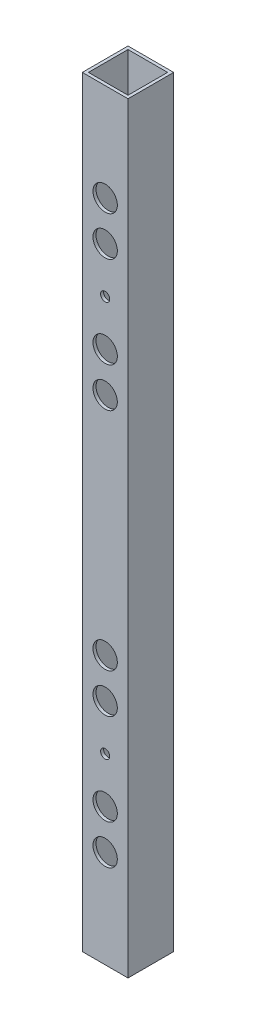
ISO-10303-21;
HEADER;
FILE_DESCRIPTION(('STEP AP214'),'2;1');
FILE_NAME('part.step','',(''),(''),'','','');
FILE_SCHEMA(('AUTOMOTIVE_DESIGN { 1 0 10303 214 1 1 1 1 }'));
ENDSEC;
DATA;
#1=APPLICATION_CONTEXT('core data for automotive mechanical design processes');
#2=APPLICATION_PROTOCOL_DEFINITION('international standard','automotive_design',2000,#1);
#3=PRODUCT_CONTEXT('',#1,'mechanical');
#4=PRODUCT('Part','Part','',(#3));
#5=PRODUCT_RELATED_PRODUCT_CATEGORY('part','',(#4));
#6=PRODUCT_DEFINITION_FORMATION('','',#4);
#7=PRODUCT_DEFINITION_CONTEXT('part definition',#1,'design');
#8=PRODUCT_DEFINITION('design','',#6,#7);
#9=PRODUCT_DEFINITION_SHAPE('','',#8);
#10=(LENGTH_UNIT() NAMED_UNIT(*) SI_UNIT(.MILLI.,.METRE.));
#11=(NAMED_UNIT(*) PLANE_ANGLE_UNIT() SI_UNIT($,.RADIAN.));
#12=(NAMED_UNIT(*) SI_UNIT($,.STERADIAN.) SOLID_ANGLE_UNIT());
#13=UNCERTAINTY_MEASURE_WITH_UNIT(LENGTH_MEASURE(1.E-05),#10,'distance_accuracy_value','');
#14=(GEOMETRIC_REPRESENTATION_CONTEXT(3) GLOBAL_UNCERTAINTY_ASSIGNED_CONTEXT((#13)) GLOBAL_UNIT_ASSIGNED_CONTEXT((#10,
#11,#12)) REPRESENTATION_CONTEXT('',''));
#15=CARTESIAN_POINT('',(0.,0.,0.));
#16=DIRECTION('',(0.,0.,1.));
#17=DIRECTION('',(1.,0.,0.));
#18=AXIS2_PLACEMENT_3D('',#15,#16,#17);
#19=CARTESIAN_POINT('',(0.,250.,0.));
#20=DIRECTION('',(0.,-1.,0.));
#21=DIRECTION('',(0.,0.,-1.));
#22=AXIS2_PLACEMENT_3D('',#19,#20,#21);
#23=PLANE('',#22);
#24=DIRECTION('',(0.,0.,-1.));
#25=VECTOR('',#24,1.);
#26=CARTESIAN_POINT('',(7.5,250.,7.5));
#27=LINE('',#26,#25);
#28=CARTESIAN_POINT('',(7.5,250.,7.5));
#29=VERTEX_POINT('',#28);
#30=CARTESIAN_POINT('',(7.5,250.,-7.5));
#31=VERTEX_POINT('',#30);
#32=EDGE_CURVE('E139',#29,#31,#27,.T.);
#33=ORIENTED_EDGE('',*,*,#32,.T.);
#34=DIRECTION('',(-1.,0.,0.));
#35=VECTOR('',#34,1.);
#36=CARTESIAN_POINT('',(-7.5,250.,-7.5));
#37=LINE('',#36,#35);
#38=CARTESIAN_POINT('',(-7.5,250.,-7.5));
#39=VERTEX_POINT('',#38);
#40=EDGE_CURVE('E142',#31,#39,#37,.T.);
#41=ORIENTED_EDGE('',*,*,#40,.T.);
#42=DIRECTION('',(0.,0.,1.));
#43=VECTOR('',#42,1.);
#44=CARTESIAN_POINT('',(-7.5,250.,7.5));
#45=LINE('',#44,#43);
#46=CARTESIAN_POINT('',(-7.5,250.,7.5));
#47=VERTEX_POINT('',#46);
#48=EDGE_CURVE('E145',#39,#47,#45,.T.);
#49=ORIENTED_EDGE('',*,*,#48,.T.);
#50=DIRECTION('',(1.,0.,0.));
#51=VECTOR('',#50,1.);
#52=CARTESIAN_POINT('',(-7.5,250.,7.5));
#53=LINE('',#52,#51);
#54=EDGE_CURVE('E147',#47,#29,#53,.T.);
#55=ORIENTED_EDGE('',*,*,#54,.T.);
#56=EDGE_LOOP('',(#33,#41,#49,#55));
#57=FACE_BOUND('',#56,.T.);
#58=DIRECTION('',(0.,0.,1.));
#59=VECTOR('',#58,1.);
#60=CARTESIAN_POINT('',(-6.5,250.,6.5));
#61=LINE('',#60,#59);
#62=CARTESIAN_POINT('',(-6.5,250.,-6.5));
#63=VERTEX_POINT('',#62);
#64=CARTESIAN_POINT('',(-6.5,250.,6.5));
#65=VERTEX_POINT('',#64);
#66=EDGE_CURVE('E101',#63,#65,#61,.T.);
#67=ORIENTED_EDGE('',*,*,#66,.F.);
#68=DIRECTION('',(-1.,0.,0.));
#69=VECTOR('',#68,1.);
#70=CARTESIAN_POINT('',(-6.5,250.,-6.5));
#71=LINE('',#70,#69);
#72=CARTESIAN_POINT('',(6.5,250.,-6.5));
#73=VERTEX_POINT('',#72);
#74=EDGE_CURVE('E123',#73,#63,#71,.T.);
#75=ORIENTED_EDGE('',*,*,#74,.F.);
#76=DIRECTION('',(0.,0.,-1.));
#77=VECTOR('',#76,1.);
#78=CARTESIAN_POINT('',(6.5,250.,6.5));
#79=LINE('',#78,#77);
#80=CARTESIAN_POINT('',(6.5,250.,6.5));
#81=VERTEX_POINT('',#80);
#82=EDGE_CURVE('E121',#81,#73,#79,.T.);
#83=ORIENTED_EDGE('',*,*,#82,.F.);
#84=DIRECTION('',(1.,0.,0.));
#85=VECTOR('',#84,1.);
#86=CARTESIAN_POINT('',(-6.5,250.,6.5));
#87=LINE('',#86,#85);
#88=EDGE_CURVE('E109',#65,#81,#87,.T.);
#89=ORIENTED_EDGE('',*,*,#88,.F.);
#90=EDGE_LOOP('',(#67,#75,#83,#89));
#91=FACE_BOUND('',#90,.T.);
#92=ADVANCED_FACE('F34',(#57,#91),#23,.F.);
#93=CARTESIAN_POINT('',(0.,0.,0.));
#94=DIRECTION('',(0.,-1.,0.));
#95=DIRECTION('',(0.,0.,-1.));
#96=AXIS2_PLACEMENT_3D('',#93,#94,#95);
#97=PLANE('',#96);
#98=DIRECTION('',(0.,0.,-1.));
#99=VECTOR('',#98,1.);
#100=CARTESIAN_POINT('',(7.5,0.,7.5));
#101=LINE('',#100,#99);
#102=CARTESIAN_POINT('',(7.5,0.,7.5));
#103=VERTEX_POINT('',#102);
#104=CARTESIAN_POINT('',(7.5,0.,-7.5));
#105=VERTEX_POINT('',#104);
#106=EDGE_CURVE('E117',#103,#105,#101,.T.);
#107=ORIENTED_EDGE('',*,*,#106,.F.);
#108=DIRECTION('',(1.,0.,0.));
#109=VECTOR('',#108,1.);
#110=CARTESIAN_POINT('',(-7.5,0.,7.5));
#111=LINE('',#110,#109);
#112=CARTESIAN_POINT('',(-7.5,0.,7.5));
#113=VERTEX_POINT('',#112);
#114=EDGE_CURVE('E143',#113,#103,#111,.T.);
#115=ORIENTED_EDGE('',*,*,#114,.F.);
#116=DIRECTION('',(0.,0.,1.));
#117=VECTOR('',#116,1.);
#118=CARTESIAN_POINT('',(-7.5,0.,7.5));
#119=LINE('',#118,#117);
#120=CARTESIAN_POINT('',(-7.5,0.,-7.5));
#121=VERTEX_POINT('',#120);
#122=EDGE_CURVE('E154',#121,#113,#119,.T.);
#123=ORIENTED_EDGE('',*,*,#122,.F.);
#124=DIRECTION('',(-1.,0.,0.));
#125=VECTOR('',#124,1.);
#126=CARTESIAN_POINT('',(-7.5,0.,-7.5));
#127=LINE('',#126,#125);
#128=EDGE_CURVE('E152',#105,#121,#127,.T.);
#129=ORIENTED_EDGE('',*,*,#128,.F.);
#130=EDGE_LOOP('',(#107,#115,#123,#129));
#131=FACE_BOUND('',#130,.T.);
#132=DIRECTION('',(-1.,0.,0.));
#133=VECTOR('',#132,1.);
#134=CARTESIAN_POINT('',(-6.5,0.,-6.5));
#135=LINE('',#134,#133);
#136=CARTESIAN_POINT('',(6.5,0.,-6.5));
#137=VERTEX_POINT('',#136);
#138=CARTESIAN_POINT('',(-6.5,0.,-6.5));
#139=VERTEX_POINT('',#138);
#140=EDGE_CURVE('E110',#137,#139,#135,.T.);
#141=ORIENTED_EDGE('',*,*,#140,.T.);
#142=DIRECTION('',(0.,0.,1.));
#143=VECTOR('',#142,1.);
#144=CARTESIAN_POINT('',(-6.5,0.,6.5));
#145=LINE('',#144,#143);
#146=CARTESIAN_POINT('',(-6.5,0.,6.5));
#147=VERTEX_POINT('',#146);
#148=EDGE_CURVE('E59',#139,#147,#145,.T.);
#149=ORIENTED_EDGE('',*,*,#148,.T.);
#150=DIRECTION('',(1.,0.,0.));
#151=VECTOR('',#150,1.);
#152=CARTESIAN_POINT('',(-6.5,0.,6.5));
#153=LINE('',#152,#151);
#154=CARTESIAN_POINT('',(6.5,0.,6.5));
#155=VERTEX_POINT('',#154);
#156=EDGE_CURVE('E116',#147,#155,#153,.T.);
#157=ORIENTED_EDGE('',*,*,#156,.T.);
#158=DIRECTION('',(0.,0.,-1.));
#159=VECTOR('',#158,1.);
#160=CARTESIAN_POINT('',(6.5,0.,6.5));
#161=LINE('',#160,#159);
#162=EDGE_CURVE('E131',#155,#137,#161,.T.);
#163=ORIENTED_EDGE('',*,*,#162,.T.);
#164=EDGE_LOOP('',(#141,#149,#157,#163));
#165=FACE_BOUND('',#164,.T.);
#166=ADVANCED_FACE('F290',(#131,#165),#97,.T.);
#167=CARTESIAN_POINT('',(7.5,250.,7.5));
#168=DIRECTION('',(-1.,0.,0.));
#169=DIRECTION('',(0.,0.,1.));
#170=AXIS2_PLACEMENT_3D('',#167,#168,#169);
#171=PLANE('',#170);
#172=ORIENTED_EDGE('',*,*,#106,.T.);
#173=DIRECTION('',(0.,-1.,0.));
#174=VECTOR('',#173,1.);
#175=CARTESIAN_POINT('',(7.5,250.,-7.5));
#176=LINE('',#175,#174);
#177=EDGE_CURVE('E11',#31,#105,#176,.T.);
#178=ORIENTED_EDGE('',*,*,#177,.F.);
#179=ORIENTED_EDGE('',*,*,#32,.F.);
#180=DIRECTION('',(0.,-1.,0.));
#181=VECTOR('',#180,1.);
#182=CARTESIAN_POINT('',(7.5,250.,7.5));
#183=LINE('',#182,#181);
#184=EDGE_CURVE('E149',#29,#103,#183,.T.);
#185=ORIENTED_EDGE('',*,*,#184,.T.);
#186=EDGE_LOOP('',(#172,#178,#179,#185));
#187=FACE_BOUND('',#186,.T.);
#188=ADVANCED_FACE('F36',(#187),#171,.F.);
#189=CARTESIAN_POINT('',(-7.5,250.,-7.5));
#190=DIRECTION('',(0.,0.,1.));
#191=DIRECTION('',(1.,0.,0.));
#192=AXIS2_PLACEMENT_3D('',#189,#190,#191);
#193=PLANE('',#192);
#194=CARTESIAN_POINT('',(0.,190.,-7.5));
#195=DIRECTION('',(0.,0.,-1.));
#196=DIRECTION('',(-1.,0.,0.));
#197=AXIS2_PLACEMENT_3D('',#194,#195,#196);
#198=CIRCLE('',#197,4.);
#199=CARTESIAN_POINT('',(-4.,190.,-7.5));
#200=VERTEX_POINT('',#199);
#201=EDGE_CURVE('E198',#200,#200,#198,.T.);
#202=ORIENTED_EDGE('',*,*,#201,.F.);
#203=EDGE_LOOP('',(#202));
#204=FACE_BOUND('',#203,.T.);
#205=CARTESIAN_POINT('',(0.,60.,-7.5));
#206=DIRECTION('',(0.,0.,-1.));
#207=DIRECTION('',(-1.,0.,0.));
#208=AXIS2_PLACEMENT_3D('',#205,#206,#207);
#209=CIRCLE('',#208,4.);
#210=CARTESIAN_POINT('',(-4.,60.,-7.5));
#211=VERTEX_POINT('',#210);
#212=EDGE_CURVE('E194',#211,#211,#209,.T.);
#213=ORIENTED_EDGE('',*,*,#212,.F.);
#214=EDGE_LOOP('',(#213));
#215=FACE_BOUND('',#214,.T.);
#216=CARTESIAN_POINT('',(0.,205.,-7.5));
#217=DIRECTION('',(0.,0.,-1.));
#218=DIRECTION('',(-1.,0.,0.));
#219=AXIS2_PLACEMENT_3D('',#216,#217,#218);
#220=CIRCLE('',#219,1.5);
#221=CARTESIAN_POINT('',(-1.5,205.,-7.5));
#222=VERTEX_POINT('',#221);
#223=EDGE_CURVE('E237',#222,#222,#220,.T.);
#224=ORIENTED_EDGE('',*,*,#223,.F.);
#225=EDGE_LOOP('',(#224));
#226=FACE_BOUND('',#225,.T.);
#227=CARTESIAN_POINT('',(0.,218.,-7.5));
#228=DIRECTION('',(0.,0.,-1.));
#229=DIRECTION('',(-1.,0.,0.));
#230=AXIS2_PLACEMENT_3D('',#227,#228,#229);
#231=CIRCLE('',#230,1.5);
#232=CARTESIAN_POINT('',(-1.5,218.,-7.5));
#233=VERTEX_POINT('',#232);
#234=EDGE_CURVE('E241',#233,#233,#231,.T.);
#235=ORIENTED_EDGE('',*,*,#234,.F.);
#236=EDGE_LOOP('',(#235));
#237=FACE_BOUND('',#236,.T.);
#238=CARTESIAN_POINT('',(0.,175.,-7.5));
#239=DIRECTION('',(0.,0.,-1.));
#240=DIRECTION('',(-1.,0.,0.));
#241=AXIS2_PLACEMENT_3D('',#238,#239,#240);
#242=CIRCLE('',#241,1.5);
#243=CARTESIAN_POINT('',(-1.5,175.,-7.5));
#244=VERTEX_POINT('',#243);
#245=EDGE_CURVE('E244',#244,#244,#242,.T.);
#246=ORIENTED_EDGE('',*,*,#245,.F.);
#247=EDGE_LOOP('',(#246));
#248=FACE_BOUND('',#247,.T.);
#249=CARTESIAN_POINT('',(0.,162.,-7.5));
#250=DIRECTION('',(0.,0.,-1.));
#251=DIRECTION('',(-1.,0.,0.));
#252=AXIS2_PLACEMENT_3D('',#249,#250,#251);
#253=CIRCLE('',#252,1.5);
#254=CARTESIAN_POINT('',(-1.5,162.,-7.5));
#255=VERTEX_POINT('',#254);
#256=EDGE_CURVE('E247',#255,#255,#253,.T.);
#257=ORIENTED_EDGE('',*,*,#256,.F.);
#258=EDGE_LOOP('',(#257));
#259=FACE_BOUND('',#258,.T.);
#260=CARTESIAN_POINT('',(0.,88.,-7.5));
#261=DIRECTION('',(0.,0.,-1.));
#262=DIRECTION('',(1.,0.,0.));
#263=AXIS2_PLACEMENT_3D('',#260,#261,#262);
#264=CIRCLE('',#263,1.5);
#265=CARTESIAN_POINT('',(1.5,88.,-7.5));
#266=VERTEX_POINT('',#265);
#267=EDGE_CURVE('E250',#266,#266,#264,.T.);
#268=ORIENTED_EDGE('',*,*,#267,.F.);
#269=EDGE_LOOP('',(#268));
#270=FACE_BOUND('',#269,.T.);
#271=CARTESIAN_POINT('',(0.,75.,-7.5));
#272=DIRECTION('',(0.,0.,-1.));
#273=DIRECTION('',(1.,0.,0.));
#274=AXIS2_PLACEMENT_3D('',#271,#272,#273);
#275=CIRCLE('',#274,1.5);
#276=CARTESIAN_POINT('',(1.5,75.,-7.5));
#277=VERTEX_POINT('',#276);
#278=EDGE_CURVE('E253',#277,#277,#275,.T.);
#279=ORIENTED_EDGE('',*,*,#278,.F.);
#280=EDGE_LOOP('',(#279));
#281=FACE_BOUND('',#280,.T.);
#282=CARTESIAN_POINT('',(0.,32.,-7.5));
#283=DIRECTION('',(0.,0.,-1.));
#284=DIRECTION('',(1.,0.,0.));
#285=AXIS2_PLACEMENT_3D('',#282,#283,#284);
#286=CIRCLE('',#285,1.5);
#287=CARTESIAN_POINT('',(1.5,32.,-7.5));
#288=VERTEX_POINT('',#287);
#289=EDGE_CURVE('E256',#288,#288,#286,.T.);
#290=ORIENTED_EDGE('',*,*,#289,.F.);
#291=EDGE_LOOP('',(#290));
#292=FACE_BOUND('',#291,.T.);
#293=CARTESIAN_POINT('',(0.,45.,-7.5));
#294=DIRECTION('',(0.,0.,-1.));
#295=DIRECTION('',(1.,0.,0.));
#296=AXIS2_PLACEMENT_3D('',#293,#294,#295);
#297=CIRCLE('',#296,1.5);
#298=CARTESIAN_POINT('',(1.5,45.,-7.5));
#299=VERTEX_POINT('',#298);
#300=EDGE_CURVE('E193',#299,#299,#297,.T.);
#301=ORIENTED_EDGE('',*,*,#300,.F.);
#302=EDGE_LOOP('',(#301));
#303=FACE_BOUND('',#302,.T.);
#304=ORIENTED_EDGE('',*,*,#128,.T.);
#305=DIRECTION('',(0.,-1.,0.));
#306=VECTOR('',#305,1.);
#307=CARTESIAN_POINT('',(-7.5,250.,-7.5));
#308=LINE('',#307,#306);
#309=EDGE_CURVE('E43',#39,#121,#308,.T.);
#310=ORIENTED_EDGE('',*,*,#309,.F.);
#311=ORIENTED_EDGE('',*,*,#40,.F.);
#312=ORIENTED_EDGE('',*,*,#177,.T.);
#313=EDGE_LOOP('',(#304,#310,#311,#312));
#314=FACE_BOUND('',#313,.T.);
#315=ADVANCED_FACE('F306',(#204,#215,#226,#237,#248,#259,#270,#281,#292,#303,#314),#193,.F.);
#316=CARTESIAN_POINT('',(-7.5,250.,7.5));
#317=DIRECTION('',(1.,0.,0.));
#318=DIRECTION('',(0.,0.,-1.));
#319=AXIS2_PLACEMENT_3D('',#316,#317,#318);
#320=PLANE('',#319);
#321=ORIENTED_EDGE('',*,*,#122,.T.);
#322=DIRECTION('',(0.,-1.,0.));
#323=VECTOR('',#322,1.);
#324=CARTESIAN_POINT('',(-7.5,250.,7.5));
#325=LINE('',#324,#323);
#326=EDGE_CURVE('E159',#47,#113,#325,.T.);
#327=ORIENTED_EDGE('',*,*,#326,.F.);
#328=ORIENTED_EDGE('',*,*,#48,.F.);
#329=ORIENTED_EDGE('',*,*,#309,.T.);
#330=EDGE_LOOP('',(#321,#327,#328,#329));
#331=FACE_BOUND('',#330,.T.);
#332=ADVANCED_FACE('F303',(#331),#320,.F.);
#333=CARTESIAN_POINT('',(-7.5,250.,7.5));
#334=DIRECTION('',(0.,0.,-1.));
#335=DIRECTION('',(-1.,0.,0.));
#336=AXIS2_PLACEMENT_3D('',#333,#334,#335);
#337=PLANE('',#336);
#338=CARTESIAN_POINT('',(0.,205.,7.5));
#339=DIRECTION('',(0.,0.,1.));
#340=DIRECTION('',(1.,0.,0.));
#341=AXIS2_PLACEMENT_3D('',#338,#339,#340);
#342=CIRCLE('',#341,4.);
#343=CARTESIAN_POINT('',(4.,205.,7.5));
#344=VERTEX_POINT('',#343);
#345=EDGE_CURVE('E207',#344,#344,#342,.T.);
#346=ORIENTED_EDGE('',*,*,#345,.F.);
#347=EDGE_LOOP('',(#346));
#348=FACE_BOUND('',#347,.T.);
#349=CARTESIAN_POINT('',(0.,175.,7.5));
#350=DIRECTION('',(0.,0.,1.));
#351=DIRECTION('',(1.,0.,0.));
#352=AXIS2_PLACEMENT_3D('',#349,#350,#351);
#353=CIRCLE('',#352,4.);
#354=CARTESIAN_POINT('',(4.,175.,7.5));
#355=VERTEX_POINT('',#354);
#356=EDGE_CURVE('E451',#355,#355,#353,.T.);
#357=ORIENTED_EDGE('',*,*,#356,.F.);
#358=EDGE_LOOP('',(#357));
#359=FACE_BOUND('',#358,.T.);
#360=CARTESIAN_POINT('',(0.,162.,7.5));
#361=DIRECTION('',(0.,0.,1.));
#362=DIRECTION('',(1.,0.,0.));
#363=AXIS2_PLACEMENT_3D('',#360,#361,#362);
#364=CIRCLE('',#363,4.);
#365=CARTESIAN_POINT('',(4.,162.,7.5));
#366=VERTEX_POINT('',#365);
#367=EDGE_CURVE('E454',#366,#366,#364,.T.);
#368=ORIENTED_EDGE('',*,*,#367,.F.);
#369=EDGE_LOOP('',(#368));
#370=FACE_BOUND('',#369,.T.);
#371=CARTESIAN_POINT('',(0.,88.,7.5));
#372=DIRECTION('',(0.,0.,1.));
#373=DIRECTION('',(-1.,0.,0.));
#374=AXIS2_PLACEMENT_3D('',#371,#372,#373);
#375=CIRCLE('',#374,4.);
#376=CARTESIAN_POINT('',(-4.,88.,7.5));
#377=VERTEX_POINT('',#376);
#378=EDGE_CURVE('E459',#377,#377,#375,.T.);
#379=ORIENTED_EDGE('',*,*,#378,.F.);
#380=EDGE_LOOP('',(#379));
#381=FACE_BOUND('',#380,.T.);
#382=CARTESIAN_POINT('',(0.,75.,7.5));
#383=DIRECTION('',(0.,0.,1.));
#384=DIRECTION('',(-1.,0.,0.));
#385=AXIS2_PLACEMENT_3D('',#382,#383,#384);
#386=CIRCLE('',#385,4.);
#387=CARTESIAN_POINT('',(-4.,75.,7.5));
#388=VERTEX_POINT('',#387);
#389=EDGE_CURVE('E462',#388,#388,#386,.T.);
#390=ORIENTED_EDGE('',*,*,#389,.F.);
#391=EDGE_LOOP('',(#390));
#392=FACE_BOUND('',#391,.T.);
#393=CARTESIAN_POINT('',(0.,45.,7.5));
#394=DIRECTION('',(0.,0.,1.));
#395=DIRECTION('',(-1.,0.,0.));
#396=AXIS2_PLACEMENT_3D('',#393,#394,#395);
#397=CIRCLE('',#396,3.99999999999999);
#398=CARTESIAN_POINT('',(-3.99999999999999,45.,7.5));
#399=VERTEX_POINT('',#398);
#400=EDGE_CURVE('E464',#399,#399,#397,.T.);
#401=ORIENTED_EDGE('',*,*,#400,.F.);
#402=EDGE_LOOP('',(#401));
#403=FACE_BOUND('',#402,.T.);
#404=CARTESIAN_POINT('',(0.,32.,7.5));
#405=DIRECTION('',(0.,0.,1.));
#406=DIRECTION('',(-1.,0.,0.));
#407=AXIS2_PLACEMENT_3D('',#404,#405,#406);
#408=CIRCLE('',#407,3.99999999999999);
#409=CARTESIAN_POINT('',(-3.99999999999999,32.,7.5));
#410=VERTEX_POINT('',#409);
#411=EDGE_CURVE('E231',#410,#410,#408,.T.);
#412=ORIENTED_EDGE('',*,*,#411,.F.);
#413=EDGE_LOOP('',(#412));
#414=FACE_BOUND('',#413,.T.);
#415=CARTESIAN_POINT('',(0.,218.,7.5));
#416=DIRECTION('',(0.,0.,1.));
#417=DIRECTION('',(1.,0.,0.));
#418=AXIS2_PLACEMENT_3D('',#415,#416,#417);
#419=CIRCLE('',#418,4.);
#420=CARTESIAN_POINT('',(4.,218.,7.5));
#421=VERTEX_POINT('',#420);
#422=EDGE_CURVE('E202',#421,#421,#419,.T.);
#423=ORIENTED_EDGE('',*,*,#422,.F.);
#424=EDGE_LOOP('',(#423));
#425=FACE_BOUND('',#424,.T.);
#426=CARTESIAN_POINT('',(0.,60.,7.50000000000001));
#427=DIRECTION('',(0.,0.,-1.));
#428=DIRECTION('',(-1.,0.,0.));
#429=AXIS2_PLACEMENT_3D('',#426,#427,#428);
#430=CIRCLE('',#429,1.5);
#431=CARTESIAN_POINT('',(-1.5,60.,7.50000000000001));
#432=VERTEX_POINT('',#431);
#433=EDGE_CURVE('E168',#432,#432,#430,.T.);
#434=ORIENTED_EDGE('',*,*,#433,.T.);
#435=EDGE_LOOP('',(#434));
#436=FACE_BOUND('',#435,.T.);
#437=CARTESIAN_POINT('',(0.,190.,7.50000000000001));
#438=DIRECTION('',(0.,0.,-1.));
#439=DIRECTION('',(-1.,0.,0.));
#440=AXIS2_PLACEMENT_3D('',#437,#438,#439);
#441=CIRCLE('',#440,1.5);
#442=CARTESIAN_POINT('',(-1.5,190.,7.50000000000001));
#443=VERTEX_POINT('',#442);
#444=EDGE_CURVE('E129',#443,#443,#441,.T.);
#445=ORIENTED_EDGE('',*,*,#444,.T.);
#446=EDGE_LOOP('',(#445));
#447=FACE_BOUND('',#446,.T.);
#448=ORIENTED_EDGE('',*,*,#114,.T.);
#449=ORIENTED_EDGE('',*,*,#184,.F.);
#450=ORIENTED_EDGE('',*,*,#54,.F.);
#451=ORIENTED_EDGE('',*,*,#326,.T.);
#452=EDGE_LOOP('',(#448,#449,#450,#451));
#453=FACE_BOUND('',#452,.T.);
#454=ADVANCED_FACE('F269',(#348,#359,#370,#381,#392,#403,#414,#425,#436,#447,#453),#337,.F.);
#455=CARTESIAN_POINT('',(-6.5,250.,6.5));
#456=DIRECTION('',(1.,0.,0.));
#457=DIRECTION('',(0.,0.,-1.));
#458=AXIS2_PLACEMENT_3D('',#455,#456,#457);
#459=PLANE('',#458);
#460=ORIENTED_EDGE('',*,*,#148,.F.);
#461=DIRECTION('',(0.,-1.,0.));
#462=VECTOR('',#461,1.);
#463=CARTESIAN_POINT('',(-6.5,250.,-6.5));
#464=LINE('',#463,#462);
#465=EDGE_CURVE('E105',#63,#139,#464,.T.);
#466=ORIENTED_EDGE('',*,*,#465,.F.);
#467=ORIENTED_EDGE('',*,*,#66,.T.);
#468=DIRECTION('',(0.,-1.,0.));
#469=VECTOR('',#468,1.);
#470=CARTESIAN_POINT('',(-6.5,250.,6.5));
#471=LINE('',#470,#469);
#472=EDGE_CURVE('E104',#65,#147,#471,.T.);
#473=ORIENTED_EDGE('',*,*,#472,.T.);
#474=EDGE_LOOP('',(#460,#466,#467,#473));
#475=FACE_BOUND('',#474,.T.);
#476=ADVANCED_FACE('F103',(#475),#459,.T.);
#477=CARTESIAN_POINT('',(-6.5,250.,6.5));
#478=DIRECTION('',(0.,0.,-1.));
#479=DIRECTION('',(-1.,0.,0.));
#480=AXIS2_PLACEMENT_3D('',#477,#478,#479);
#481=PLANE('',#480);
#482=CARTESIAN_POINT('',(0.,205.,6.5));
#483=DIRECTION('',(0.,0.,-1.));
#484=DIRECTION('',(-1.,0.,0.));
#485=AXIS2_PLACEMENT_3D('',#482,#483,#484);
#486=CIRCLE('',#485,4.);
#487=CARTESIAN_POINT('',(-4.,205.,6.5));
#488=VERTEX_POINT('',#487);
#489=EDGE_CURVE('E38',#488,#488,#486,.T.);
#490=ORIENTED_EDGE('',*,*,#489,.F.);
#491=EDGE_LOOP('',(#490));
#492=FACE_BOUND('',#491,.T.);
#493=CARTESIAN_POINT('',(0.,175.,6.5));
#494=DIRECTION('',(0.,0.,-1.));
#495=DIRECTION('',(-1.,0.,0.));
#496=AXIS2_PLACEMENT_3D('',#493,#494,#495);
#497=CIRCLE('',#496,4.);
#498=CARTESIAN_POINT('',(-4.,175.,6.5));
#499=VERTEX_POINT('',#498);
#500=EDGE_CURVE('E218',#499,#499,#497,.T.);
#501=ORIENTED_EDGE('',*,*,#500,.F.);
#502=EDGE_LOOP('',(#501));
#503=FACE_BOUND('',#502,.T.);
#504=CARTESIAN_POINT('',(0.,162.,6.5));
#505=DIRECTION('',(0.,0.,-1.));
#506=DIRECTION('',(-1.,0.,0.));
#507=AXIS2_PLACEMENT_3D('',#504,#505,#506);
#508=CIRCLE('',#507,4.);
#509=CARTESIAN_POINT('',(-4.,162.,6.5));
#510=VERTEX_POINT('',#509);
#511=EDGE_CURVE('E216',#510,#510,#508,.T.);
#512=ORIENTED_EDGE('',*,*,#511,.F.);
#513=EDGE_LOOP('',(#512));
#514=FACE_BOUND('',#513,.T.);
#515=CARTESIAN_POINT('',(0.,88.,6.5));
#516=DIRECTION('',(0.,0.,-1.));
#517=DIRECTION('',(-1.,0.,0.));
#518=AXIS2_PLACEMENT_3D('',#515,#516,#517);
#519=CIRCLE('',#518,4.);
#520=CARTESIAN_POINT('',(-4.,88.,6.5));
#521=VERTEX_POINT('',#520);
#522=EDGE_CURVE('E213',#521,#521,#519,.T.);
#523=ORIENTED_EDGE('',*,*,#522,.F.);
#524=EDGE_LOOP('',(#523));
#525=FACE_BOUND('',#524,.T.);
#526=CARTESIAN_POINT('',(0.,75.,6.5));
#527=DIRECTION('',(0.,0.,-1.));
#528=DIRECTION('',(-1.,0.,0.));
#529=AXIS2_PLACEMENT_3D('',#526,#527,#528);
#530=CIRCLE('',#529,4.);
#531=CARTESIAN_POINT('',(-4.,75.,6.5));
#532=VERTEX_POINT('',#531);
#533=EDGE_CURVE('E210',#532,#532,#530,.T.);
#534=ORIENTED_EDGE('',*,*,#533,.F.);
#535=EDGE_LOOP('',(#534));
#536=FACE_BOUND('',#535,.T.);
#537=CARTESIAN_POINT('',(0.,45.,6.5));
#538=DIRECTION('',(0.,0.,-1.));
#539=DIRECTION('',(-1.,0.,0.));
#540=AXIS2_PLACEMENT_3D('',#537,#538,#539);
#541=CIRCLE('',#540,3.99999999999999);
#542=CARTESIAN_POINT('',(-3.99999999999999,45.,6.5));
#543=VERTEX_POINT('',#542);
#544=EDGE_CURVE('E206',#543,#543,#541,.T.);
#545=ORIENTED_EDGE('',*,*,#544,.F.);
#546=EDGE_LOOP('',(#545));
#547=FACE_BOUND('',#546,.T.);
#548=CARTESIAN_POINT('',(0.,32.,6.5));
#549=DIRECTION('',(0.,0.,-1.));
#550=DIRECTION('',(-1.,0.,0.));
#551=AXIS2_PLACEMENT_3D('',#548,#549,#550);
#552=CIRCLE('',#551,3.99999999999999);
#553=CARTESIAN_POINT('',(-3.99999999999999,32.,6.5));
#554=VERTEX_POINT('',#553);
#555=EDGE_CURVE('E203',#554,#554,#552,.T.);
#556=ORIENTED_EDGE('',*,*,#555,.F.);
#557=EDGE_LOOP('',(#556));
#558=FACE_BOUND('',#557,.T.);
#559=CARTESIAN_POINT('',(0.,218.,6.5));
#560=DIRECTION('',(0.,0.,-1.));
#561=DIRECTION('',(-1.,0.,0.));
#562=AXIS2_PLACEMENT_3D('',#559,#560,#561);
#563=CIRCLE('',#562,4.);
#564=CARTESIAN_POINT('',(-4.,218.,6.5));
#565=VERTEX_POINT('',#564);
#566=EDGE_CURVE('E199',#565,#565,#563,.T.);
#567=ORIENTED_EDGE('',*,*,#566,.F.);
#568=EDGE_LOOP('',(#567));
#569=FACE_BOUND('',#568,.T.);
#570=CARTESIAN_POINT('',(0.,60.,6.50000000000001));
#571=DIRECTION('',(0.,0.,-1.));
#572=DIRECTION('',(-1.,0.,0.));
#573=AXIS2_PLACEMENT_3D('',#570,#571,#572);
#574=CIRCLE('',#573,1.5);
#575=CARTESIAN_POINT('',(-1.5,60.,6.50000000000001));
#576=VERTEX_POINT('',#575);
#577=EDGE_CURVE('E240',#576,#576,#574,.T.);
#578=ORIENTED_EDGE('',*,*,#577,.F.);
#579=EDGE_LOOP('',(#578));
#580=FACE_BOUND('',#579,.T.);
#581=CARTESIAN_POINT('',(0.,190.,6.50000000000001));
#582=DIRECTION('',(0.,0.,-1.));
#583=DIRECTION('',(-1.,0.,0.));
#584=AXIS2_PLACEMENT_3D('',#581,#582,#583);
#585=CIRCLE('',#584,1.5);
#586=CARTESIAN_POINT('',(-1.5,190.,6.50000000000001));
#587=VERTEX_POINT('',#586);
#588=EDGE_CURVE('E189',#587,#587,#585,.T.);
#589=ORIENTED_EDGE('',*,*,#588,.F.);
#590=EDGE_LOOP('',(#589));
#591=FACE_BOUND('',#590,.T.);
#592=ORIENTED_EDGE('',*,*,#156,.F.);
#593=ORIENTED_EDGE('',*,*,#472,.F.);
#594=ORIENTED_EDGE('',*,*,#88,.T.);
#595=DIRECTION('',(0.,-1.,0.));
#596=VECTOR('',#595,1.);
#597=CARTESIAN_POINT('',(6.5,250.,6.5));
#598=LINE('',#597,#596);
#599=EDGE_CURVE('E118',#81,#155,#598,.T.);
#600=ORIENTED_EDGE('',*,*,#599,.T.);
#601=EDGE_LOOP('',(#592,#593,#594,#600));
#602=FACE_BOUND('',#601,.T.);
#603=ADVANCED_FACE('F113',(#492,#503,#514,#525,#536,#547,#558,#569,#580,#591,#602),#481,.T.);
#604=CARTESIAN_POINT('',(6.5,250.,6.5));
#605=DIRECTION('',(-1.,0.,0.));
#606=DIRECTION('',(0.,0.,1.));
#607=AXIS2_PLACEMENT_3D('',#604,#605,#606);
#608=PLANE('',#607);
#609=ORIENTED_EDGE('',*,*,#162,.F.);
#610=ORIENTED_EDGE('',*,*,#599,.F.);
#611=ORIENTED_EDGE('',*,*,#82,.T.);
#612=DIRECTION('',(0.,-1.,0.));
#613=VECTOR('',#612,1.);
#614=CARTESIAN_POINT('',(6.5,250.,-6.5));
#615=LINE('',#614,#613);
#616=EDGE_CURVE('E51',#73,#137,#615,.T.);
#617=ORIENTED_EDGE('',*,*,#616,.T.);
#618=EDGE_LOOP('',(#609,#610,#611,#617));
#619=FACE_BOUND('',#618,.T.);
#620=ADVANCED_FACE('F285',(#619),#608,.T.);
#621=CARTESIAN_POINT('',(-6.5,250.,-6.5));
#622=DIRECTION('',(0.,0.,1.));
#623=DIRECTION('',(1.,0.,0.));
#624=AXIS2_PLACEMENT_3D('',#621,#622,#623);
#625=PLANE('',#624);
#626=CARTESIAN_POINT('',(0.,190.,-6.5));
#627=DIRECTION('',(0.,0.,1.));
#628=DIRECTION('',(1.,0.,0.));
#629=AXIS2_PLACEMENT_3D('',#626,#627,#628);
#630=CIRCLE('',#629,4.);
#631=CARTESIAN_POINT('',(4.,190.,-6.5));
#632=VERTEX_POINT('',#631);
#633=EDGE_CURVE('E195',#632,#632,#630,.T.);
#634=ORIENTED_EDGE('',*,*,#633,.F.);
#635=EDGE_LOOP('',(#634));
#636=FACE_BOUND('',#635,.T.);
#637=CARTESIAN_POINT('',(0.,60.,-6.5));
#638=DIRECTION('',(0.,0.,1.));
#639=DIRECTION('',(1.,0.,0.));
#640=AXIS2_PLACEMENT_3D('',#637,#638,#639);
#641=CIRCLE('',#640,4.);
#642=CARTESIAN_POINT('',(4.,60.,-6.5));
#643=VERTEX_POINT('',#642);
#644=EDGE_CURVE('E190',#643,#643,#641,.T.);
#645=ORIENTED_EDGE('',*,*,#644,.F.);
#646=EDGE_LOOP('',(#645));
#647=FACE_BOUND('',#646,.T.);
#648=CARTESIAN_POINT('',(0.,205.,-6.50000000000001));
#649=DIRECTION('',(0.,0.,1.));
#650=DIRECTION('',(1.,0.,0.));
#651=AXIS2_PLACEMENT_3D('',#648,#649,#650);
#652=CIRCLE('',#651,1.5);
#653=CARTESIAN_POINT('',(1.5,205.,-6.50000000000001));
#654=VERTEX_POINT('',#653);
#655=EDGE_CURVE('E186',#654,#654,#652,.T.);
#656=ORIENTED_EDGE('',*,*,#655,.F.);
#657=EDGE_LOOP('',(#656));
#658=FACE_BOUND('',#657,.T.);
#659=CARTESIAN_POINT('',(0.,218.,-6.50000000000001));
#660=DIRECTION('',(0.,0.,1.));
#661=DIRECTION('',(1.,0.,0.));
#662=AXIS2_PLACEMENT_3D('',#659,#660,#661);
#663=CIRCLE('',#662,1.5);
#664=CARTESIAN_POINT('',(1.5,218.,-6.50000000000001));
#665=VERTEX_POINT('',#664);
#666=EDGE_CURVE('E183',#665,#665,#663,.T.);
#667=ORIENTED_EDGE('',*,*,#666,.F.);
#668=EDGE_LOOP('',(#667));
#669=FACE_BOUND('',#668,.T.);
#670=CARTESIAN_POINT('',(0.,175.,-6.50000000000001));
#671=DIRECTION('',(0.,0.,1.));
#672=DIRECTION('',(1.,0.,0.));
#673=AXIS2_PLACEMENT_3D('',#670,#671,#672);
#674=CIRCLE('',#673,1.5);
#675=CARTESIAN_POINT('',(1.5,175.,-6.50000000000001));
#676=VERTEX_POINT('',#675);
#677=EDGE_CURVE('E180',#676,#676,#674,.T.);
#678=ORIENTED_EDGE('',*,*,#677,.F.);
#679=EDGE_LOOP('',(#678));
#680=FACE_BOUND('',#679,.T.);
#681=CARTESIAN_POINT('',(0.,162.,-6.50000000000001));
#682=DIRECTION('',(0.,0.,1.));
#683=DIRECTION('',(1.,0.,0.));
#684=AXIS2_PLACEMENT_3D('',#681,#682,#683);
#685=CIRCLE('',#684,1.5);
#686=CARTESIAN_POINT('',(1.5,162.,-6.50000000000001));
#687=VERTEX_POINT('',#686);
#688=EDGE_CURVE('E177',#687,#687,#685,.T.);
#689=ORIENTED_EDGE('',*,*,#688,.F.);
#690=EDGE_LOOP('',(#689));
#691=FACE_BOUND('',#690,.T.);
#692=CARTESIAN_POINT('',(0.,88.,-6.50000000000001));
#693=DIRECTION('',(0.,0.,1.));
#694=DIRECTION('',(1.,0.,0.));
#695=AXIS2_PLACEMENT_3D('',#692,#693,#694);
#696=CIRCLE('',#695,1.5);
#697=CARTESIAN_POINT('',(1.5,88.,-6.50000000000001));
#698=VERTEX_POINT('',#697);
#699=EDGE_CURVE('E174',#698,#698,#696,.T.);
#700=ORIENTED_EDGE('',*,*,#699,.F.);
#701=EDGE_LOOP('',(#700));
#702=FACE_BOUND('',#701,.T.);
#703=CARTESIAN_POINT('',(0.,75.,-6.50000000000001));
#704=DIRECTION('',(0.,0.,1.));
#705=DIRECTION('',(1.,0.,0.));
#706=AXIS2_PLACEMENT_3D('',#703,#704,#705);
#707=CIRCLE('',#706,1.5);
#708=CARTESIAN_POINT('',(1.5,75.,-6.50000000000001));
#709=VERTEX_POINT('',#708);
#710=EDGE_CURVE('E171',#709,#709,#707,.T.);
#711=ORIENTED_EDGE('',*,*,#710,.F.);
#712=EDGE_LOOP('',(#711));
#713=FACE_BOUND('',#712,.T.);
#714=CARTESIAN_POINT('',(0.,32.,-6.50000000000001));
#715=DIRECTION('',(0.,0.,1.));
#716=DIRECTION('',(1.,0.,0.));
#717=AXIS2_PLACEMENT_3D('',#714,#715,#716);
#718=CIRCLE('',#717,1.5);
#719=CARTESIAN_POINT('',(1.5,32.,-6.50000000000001));
#720=VERTEX_POINT('',#719);
#721=EDGE_CURVE('E167',#720,#720,#718,.T.);
#722=ORIENTED_EDGE('',*,*,#721,.F.);
#723=EDGE_LOOP('',(#722));
#724=FACE_BOUND('',#723,.T.);
#725=CARTESIAN_POINT('',(0.,45.,-6.50000000000001));
#726=DIRECTION('',(0.,0.,1.));
#727=DIRECTION('',(1.,0.,0.));
#728=AXIS2_PLACEMENT_3D('',#725,#726,#727);
#729=CIRCLE('',#728,1.5);
#730=CARTESIAN_POINT('',(1.5,45.,-6.50000000000001));
#731=VERTEX_POINT('',#730);
#732=EDGE_CURVE('E164',#731,#731,#729,.T.);
#733=ORIENTED_EDGE('',*,*,#732,.F.);
#734=EDGE_LOOP('',(#733));
#735=FACE_BOUND('',#734,.T.);
#736=ORIENTED_EDGE('',*,*,#140,.F.);
#737=ORIENTED_EDGE('',*,*,#616,.F.);
#738=ORIENTED_EDGE('',*,*,#74,.T.);
#739=ORIENTED_EDGE('',*,*,#465,.T.);
#740=EDGE_LOOP('',(#736,#737,#738,#739));
#741=FACE_BOUND('',#740,.T.);
#742=ADVANCED_FACE('F275',(#636,#647,#658,#669,#680,#691,#702,#713,#724,#735,#741),#625,.T.);
#743=CARTESIAN_POINT('',(0.,190.,242.5));
#744=DIRECTION('',(0.,0.,-1.));
#745=DIRECTION('',(-1.,0.,0.));
#746=AXIS2_PLACEMENT_3D('',#743,#744,#745);
#747=CYLINDRICAL_SURFACE('',#746,1.5);
#748=ORIENTED_EDGE('',*,*,#588,.T.);
#749=EDGE_LOOP('',(#748));
#750=FACE_BOUND('',#749,.T.);
#751=ORIENTED_EDGE('',*,*,#444,.F.);
#752=EDGE_LOOP('',(#751));
#753=FACE_BOUND('',#752,.T.);
#754=ADVANCED_FACE('F272',(#750,#753),#747,.F.);
#755=CARTESIAN_POINT('',(0.,45.,242.5));
#756=DIRECTION('',(0.,0.,-1.));
#757=DIRECTION('',(-1.,0.,0.));
#758=AXIS2_PLACEMENT_3D('',#755,#756,#757);
#759=CYLINDRICAL_SURFACE('',#758,1.5);
#760=ORIENTED_EDGE('',*,*,#732,.T.);
#761=EDGE_LOOP('',(#760));
#762=FACE_BOUND('',#761,.T.);
#763=ORIENTED_EDGE('',*,*,#300,.T.);
#764=EDGE_LOOP('',(#763));
#765=FACE_BOUND('',#764,.T.);
#766=ADVANCED_FACE('F274',(#762,#765),#759,.F.);
#767=CARTESIAN_POINT('',(0.,32.,242.5));
#768=DIRECTION('',(0.,0.,-1.));
#769=DIRECTION('',(-1.,0.,0.));
#770=AXIS2_PLACEMENT_3D('',#767,#768,#769);
#771=CYLINDRICAL_SURFACE('',#770,1.5);
#772=ORIENTED_EDGE('',*,*,#721,.T.);
#773=EDGE_LOOP('',(#772));
#774=FACE_BOUND('',#773,.T.);
#775=ORIENTED_EDGE('',*,*,#289,.T.);
#776=EDGE_LOOP('',(#775));
#777=FACE_BOUND('',#776,.T.);
#778=ADVANCED_FACE('F282',(#774,#777),#771,.F.);
#779=CARTESIAN_POINT('',(0.,75.,242.5));
#780=DIRECTION('',(0.,0.,-1.));
#781=DIRECTION('',(-1.,0.,0.));
#782=AXIS2_PLACEMENT_3D('',#779,#780,#781);
#783=CYLINDRICAL_SURFACE('',#782,1.5);
#784=ORIENTED_EDGE('',*,*,#710,.T.);
#785=EDGE_LOOP('',(#784));
#786=FACE_BOUND('',#785,.T.);
#787=ORIENTED_EDGE('',*,*,#278,.T.);
#788=EDGE_LOOP('',(#787));
#789=FACE_BOUND('',#788,.T.);
#790=ADVANCED_FACE('F394',(#786,#789),#783,.F.);
#791=CARTESIAN_POINT('',(0.,88.,242.5));
#792=DIRECTION('',(0.,0.,-1.));
#793=DIRECTION('',(-1.,0.,0.));
#794=AXIS2_PLACEMENT_3D('',#791,#792,#793);
#795=CYLINDRICAL_SURFACE('',#794,1.5);
#796=ORIENTED_EDGE('',*,*,#699,.T.);
#797=EDGE_LOOP('',(#796));
#798=FACE_BOUND('',#797,.T.);
#799=ORIENTED_EDGE('',*,*,#267,.T.);
#800=EDGE_LOOP('',(#799));
#801=FACE_BOUND('',#800,.T.);
#802=ADVANCED_FACE('F398',(#798,#801),#795,.F.);
#803=CARTESIAN_POINT('',(0.,162.,242.5));
#804=DIRECTION('',(0.,0.,-1.));
#805=DIRECTION('',(-1.,0.,0.));
#806=AXIS2_PLACEMENT_3D('',#803,#804,#805);
#807=CYLINDRICAL_SURFACE('',#806,1.5);
#808=ORIENTED_EDGE('',*,*,#688,.T.);
#809=EDGE_LOOP('',(#808));
#810=FACE_BOUND('',#809,.T.);
#811=ORIENTED_EDGE('',*,*,#256,.T.);
#812=EDGE_LOOP('',(#811));
#813=FACE_BOUND('',#812,.T.);
#814=ADVANCED_FACE('F402',(#810,#813),#807,.F.);
#815=CARTESIAN_POINT('',(0.,175.,242.5));
#816=DIRECTION('',(0.,0.,-1.));
#817=DIRECTION('',(-1.,0.,0.));
#818=AXIS2_PLACEMENT_3D('',#815,#816,#817);
#819=CYLINDRICAL_SURFACE('',#818,1.5);
#820=ORIENTED_EDGE('',*,*,#677,.T.);
#821=EDGE_LOOP('',(#820));
#822=FACE_BOUND('',#821,.T.);
#823=ORIENTED_EDGE('',*,*,#245,.T.);
#824=EDGE_LOOP('',(#823));
#825=FACE_BOUND('',#824,.T.);
#826=ADVANCED_FACE('F406',(#822,#825),#819,.F.);
#827=CARTESIAN_POINT('',(0.,218.,242.5));
#828=DIRECTION('',(0.,0.,-1.));
#829=DIRECTION('',(-1.,0.,0.));
#830=AXIS2_PLACEMENT_3D('',#827,#828,#829);
#831=CYLINDRICAL_SURFACE('',#830,1.5);
#832=ORIENTED_EDGE('',*,*,#666,.T.);
#833=EDGE_LOOP('',(#832));
#834=FACE_BOUND('',#833,.T.);
#835=ORIENTED_EDGE('',*,*,#234,.T.);
#836=EDGE_LOOP('',(#835));
#837=FACE_BOUND('',#836,.T.);
#838=ADVANCED_FACE('F388',(#834,#837),#831,.F.);
#839=CARTESIAN_POINT('',(0.,205.,242.5));
#840=DIRECTION('',(0.,0.,-1.));
#841=DIRECTION('',(-1.,0.,0.));
#842=AXIS2_PLACEMENT_3D('',#839,#840,#841);
#843=CYLINDRICAL_SURFACE('',#842,1.5);
#844=ORIENTED_EDGE('',*,*,#655,.T.);
#845=EDGE_LOOP('',(#844));
#846=FACE_BOUND('',#845,.T.);
#847=ORIENTED_EDGE('',*,*,#223,.T.);
#848=EDGE_LOOP('',(#847));
#849=FACE_BOUND('',#848,.T.);
#850=ADVANCED_FACE('F378',(#846,#849),#843,.F.);
#851=CARTESIAN_POINT('',(0.,60.,242.5));
#852=DIRECTION('',(0.,0.,-1.));
#853=DIRECTION('',(-1.,0.,0.));
#854=AXIS2_PLACEMENT_3D('',#851,#852,#853);
#855=CYLINDRICAL_SURFACE('',#854,1.5);
#856=ORIENTED_EDGE('',*,*,#577,.T.);
#857=EDGE_LOOP('',(#856));
#858=FACE_BOUND('',#857,.T.);
#859=ORIENTED_EDGE('',*,*,#433,.F.);
#860=EDGE_LOOP('',(#859));
#861=FACE_BOUND('',#860,.T.);
#862=ADVANCED_FACE('F374',(#858,#861),#855,.F.);
#863=CARTESIAN_POINT('',(0.,60.,-5.5));
#864=DIRECTION('',(0.,0.,-1.));
#865=DIRECTION('',(-1.,0.,0.));
#866=AXIS2_PLACEMENT_3D('',#863,#864,#865);
#867=CYLINDRICAL_SURFACE('',#866,4.);
#868=ORIENTED_EDGE('',*,*,#644,.T.);
#869=EDGE_LOOP('',(#868));
#870=FACE_BOUND('',#869,.T.);
#871=ORIENTED_EDGE('',*,*,#212,.T.);
#872=EDGE_LOOP('',(#871));
#873=FACE_BOUND('',#872,.T.);
#874=ADVANCED_FACE('F377',(#870,#873),#867,.F.);
#875=CARTESIAN_POINT('',(0.,190.,-5.5));
#876=DIRECTION('',(0.,0.,-1.));
#877=DIRECTION('',(-1.,0.,0.));
#878=AXIS2_PLACEMENT_3D('',#875,#876,#877);
#879=CYLINDRICAL_SURFACE('',#878,4.);
#880=ORIENTED_EDGE('',*,*,#633,.T.);
#881=EDGE_LOOP('',(#880));
#882=FACE_BOUND('',#881,.T.);
#883=ORIENTED_EDGE('',*,*,#201,.T.);
#884=EDGE_LOOP('',(#883));
#885=FACE_BOUND('',#884,.T.);
#886=ADVANCED_FACE('F385',(#882,#885),#879,.F.);
#887=CARTESIAN_POINT('',(0.,218.,5.5));
#888=DIRECTION('',(0.,0.,1.));
#889=DIRECTION('',(1.,0.,0.));
#890=AXIS2_PLACEMENT_3D('',#887,#888,#889);
#891=CYLINDRICAL_SURFACE('',#890,4.);
#892=ORIENTED_EDGE('',*,*,#566,.T.);
#893=EDGE_LOOP('',(#892));
#894=FACE_BOUND('',#893,.T.);
#895=ORIENTED_EDGE('',*,*,#422,.T.);
#896=EDGE_LOOP('',(#895));
#897=FACE_BOUND('',#896,.T.);
#898=ADVANCED_FACE('F416',(#894,#897),#891,.F.);
#899=CARTESIAN_POINT('',(0.,32.,5.5));
#900=DIRECTION('',(0.,0.,1.));
#901=DIRECTION('',(1.,0.,0.));
#902=AXIS2_PLACEMENT_3D('',#899,#900,#901);
#903=CYLINDRICAL_SURFACE('',#902,3.99999999999999);
#904=ORIENTED_EDGE('',*,*,#555,.T.);
#905=EDGE_LOOP('',(#904));
#906=FACE_BOUND('',#905,.T.);
#907=ORIENTED_EDGE('',*,*,#411,.T.);
#908=EDGE_LOOP('',(#907));
#909=FACE_BOUND('',#908,.T.);
#910=ADVANCED_FACE('F420',(#906,#909),#903,.F.);
#911=CARTESIAN_POINT('',(0.,45.,5.5));
#912=DIRECTION('',(0.,0.,1.));
#913=DIRECTION('',(1.,0.,0.));
#914=AXIS2_PLACEMENT_3D('',#911,#912,#913);
#915=CYLINDRICAL_SURFACE('',#914,3.99999999999999);
#916=ORIENTED_EDGE('',*,*,#544,.T.);
#917=EDGE_LOOP('',(#916));
#918=FACE_BOUND('',#917,.T.);
#919=ORIENTED_EDGE('',*,*,#400,.T.);
#920=EDGE_LOOP('',(#919));
#921=FACE_BOUND('',#920,.T.);
#922=ADVANCED_FACE('F424',(#918,#921),#915,.F.);
#923=CARTESIAN_POINT('',(0.,75.,5.5));
#924=DIRECTION('',(0.,0.,1.));
#925=DIRECTION('',(1.,0.,0.));
#926=AXIS2_PLACEMENT_3D('',#923,#924,#925);
#927=CYLINDRICAL_SURFACE('',#926,4.);
#928=ORIENTED_EDGE('',*,*,#533,.T.);
#929=EDGE_LOOP('',(#928));
#930=FACE_BOUND('',#929,.T.);
#931=ORIENTED_EDGE('',*,*,#389,.T.);
#932=EDGE_LOOP('',(#931));
#933=FACE_BOUND('',#932,.T.);
#934=ADVANCED_FACE('F428',(#930,#933),#927,.F.);
#935=CARTESIAN_POINT('',(0.,88.,5.5));
#936=DIRECTION('',(0.,0.,1.));
#937=DIRECTION('',(1.,0.,0.));
#938=AXIS2_PLACEMENT_3D('',#935,#936,#937);
#939=CYLINDRICAL_SURFACE('',#938,4.);
#940=ORIENTED_EDGE('',*,*,#522,.T.);
#941=EDGE_LOOP('',(#940));
#942=FACE_BOUND('',#941,.T.);
#943=ORIENTED_EDGE('',*,*,#378,.T.);
#944=EDGE_LOOP('',(#943));
#945=FACE_BOUND('',#944,.T.);
#946=ADVANCED_FACE('F432',(#942,#945),#939,.F.);
#947=CARTESIAN_POINT('',(0.,162.,5.5));
#948=DIRECTION('',(0.,0.,1.));
#949=DIRECTION('',(1.,0.,0.));
#950=AXIS2_PLACEMENT_3D('',#947,#948,#949);
#951=CYLINDRICAL_SURFACE('',#950,4.);
#952=ORIENTED_EDGE('',*,*,#511,.T.);
#953=EDGE_LOOP('',(#952));
#954=FACE_BOUND('',#953,.T.);
#955=ORIENTED_EDGE('',*,*,#367,.T.);
#956=EDGE_LOOP('',(#955));
#957=FACE_BOUND('',#956,.T.);
#958=ADVANCED_FACE('F436',(#954,#957),#951,.F.);
#959=CARTESIAN_POINT('',(0.,175.,5.5));
#960=DIRECTION('',(0.,0.,1.));
#961=DIRECTION('',(1.,0.,0.));
#962=AXIS2_PLACEMENT_3D('',#959,#960,#961);
#963=CYLINDRICAL_SURFACE('',#962,4.);
#964=ORIENTED_EDGE('',*,*,#500,.T.);
#965=EDGE_LOOP('',(#964));
#966=FACE_BOUND('',#965,.T.);
#967=ORIENTED_EDGE('',*,*,#356,.T.);
#968=EDGE_LOOP('',(#967));
#969=FACE_BOUND('',#968,.T.);
#970=ADVANCED_FACE('F440',(#966,#969),#963,.F.);
#971=CARTESIAN_POINT('',(0.,205.,5.5));
#972=DIRECTION('',(0.,0.,1.));
#973=DIRECTION('',(1.,0.,0.));
#974=AXIS2_PLACEMENT_3D('',#971,#972,#973);
#975=CYLINDRICAL_SURFACE('',#974,4.);
#976=ORIENTED_EDGE('',*,*,#489,.T.);
#977=EDGE_LOOP('',(#976));
#978=FACE_BOUND('',#977,.T.);
#979=ORIENTED_EDGE('',*,*,#345,.T.);
#980=EDGE_LOOP('',(#979));
#981=FACE_BOUND('',#980,.T.);
#982=ADVANCED_FACE('F444',(#978,#981),#975,.F.);
#983=CLOSED_SHELL('',(#92,#166,#188,#315,#332,#454,#476,#603,#620,#742,#754,#766,#778,#790,#802,
#814,#826,#838,#850,#862,#874,#886,#898,#910,#922,#934,#946,#958,#970,#982));
#984=MANIFOLD_SOLID_BREP('B2',#983);
#985=ADVANCED_BREP_SHAPE_REPRESENTATION('',(#18,#984),#14);
#986=SHAPE_DEFINITION_REPRESENTATION(#9,#985);
ENDSEC;
END-ISO-10303-21;
